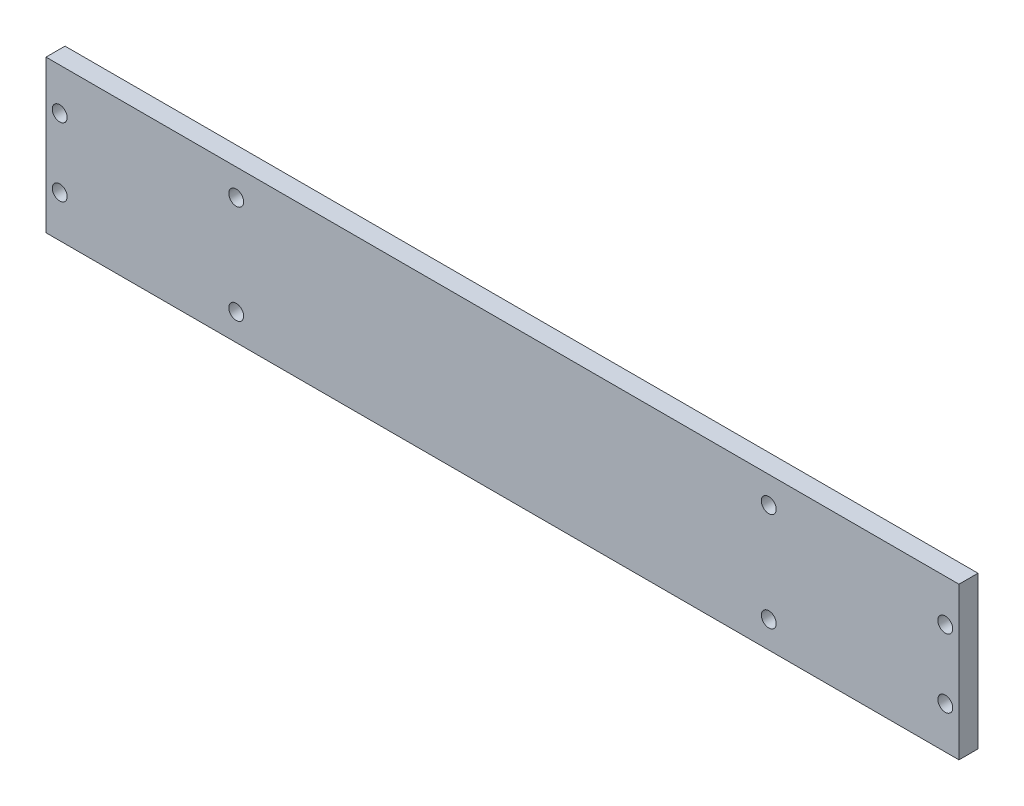
ISO-10303-21;
HEADER;
FILE_DESCRIPTION(('STEP AP214'),'2;1');
FILE_NAME('part.step','',(''),(''),'','','');
FILE_SCHEMA(('AUTOMOTIVE_DESIGN { 1 0 10303 214 1 1 1 1 }'));
ENDSEC;
DATA;
#1=APPLICATION_CONTEXT('core data for automotive mechanical design processes');
#2=APPLICATION_PROTOCOL_DEFINITION('international standard','automotive_design',2000,#1);
#3=PRODUCT_CONTEXT('',#1,'mechanical');
#4=PRODUCT('Part','Part','',(#3));
#5=PRODUCT_RELATED_PRODUCT_CATEGORY('part','',(#4));
#6=PRODUCT_DEFINITION_FORMATION('','',#4);
#7=PRODUCT_DEFINITION_CONTEXT('part definition',#1,'design');
#8=PRODUCT_DEFINITION('design','',#6,#7);
#9=PRODUCT_DEFINITION_SHAPE('','',#8);
#10=(LENGTH_UNIT() NAMED_UNIT(*) SI_UNIT(.MILLI.,.METRE.));
#11=(NAMED_UNIT(*) PLANE_ANGLE_UNIT() SI_UNIT($,.RADIAN.));
#12=(NAMED_UNIT(*) SI_UNIT($,.STERADIAN.) SOLID_ANGLE_UNIT());
#13=UNCERTAINTY_MEASURE_WITH_UNIT(LENGTH_MEASURE(1.E-05),#10,'distance_accuracy_value','');
#14=(GEOMETRIC_REPRESENTATION_CONTEXT(3) GLOBAL_UNCERTAINTY_ASSIGNED_CONTEXT((#13)) GLOBAL_UNIT_ASSIGNED_CONTEXT((#10,
#11,#12)) REPRESENTATION_CONTEXT('',''));
#15=CARTESIAN_POINT('',(0.,0.,0.));
#16=DIRECTION('',(0.,0.,1.));
#17=DIRECTION('',(1.,0.,0.));
#18=AXIS2_PLACEMENT_3D('',#15,#16,#17);
#19=CARTESIAN_POINT('',(0.,0.,6.35));
#20=DIRECTION('',(0.,0.,1.));
#21=DIRECTION('',(1.,0.,0.));
#22=AXIS2_PLACEMENT_3D('',#19,#20,#21);
#23=PLANE('',#22);
#24=CARTESIAN_POINT('',(147.828,11.43,6.35));
#25=DIRECTION('',(0.,0.,1.));
#26=DIRECTION('',(1.,0.,0.));
#27=AXIS2_PLACEMENT_3D('',#24,#25,#26);
#28=CIRCLE('',#27,2.4892);
#29=CARTESIAN_POINT('',(150.3172,11.43,6.35));
#30=VERTEX_POINT('',#29);
#31=EDGE_CURVE('E153',#30,#30,#28,.T.);
#32=ORIENTED_EDGE('',*,*,#31,.F.);
#33=EDGE_LOOP('',(#32));
#34=FACE_BOUND('',#33,.T.);
#35=CARTESIAN_POINT('',(-147.828,11.43,6.35));
#36=DIRECTION('',(0.,0.,1.));
#37=DIRECTION('',(1.,0.,0.));
#38=AXIS2_PLACEMENT_3D('',#35,#36,#37);
#39=CIRCLE('',#38,2.4892);
#40=CARTESIAN_POINT('',(-145.3388,11.43,6.35));
#41=VERTEX_POINT('',#40);
#42=EDGE_CURVE('E141',#41,#41,#39,.T.);
#43=ORIENTED_EDGE('',*,*,#42,.F.);
#44=EDGE_LOOP('',(#43));
#45=FACE_BOUND('',#44,.T.);
#46=CARTESIAN_POINT('',(88.9,-16.51,6.35));
#47=DIRECTION('',(0.,0.,1.));
#48=DIRECTION('',(1.,0.,0.));
#49=AXIS2_PLACEMENT_3D('',#46,#47,#48);
#50=CIRCLE('',#49,2.4892);
#51=CARTESIAN_POINT('',(91.3892,-16.51,6.35));
#52=VERTEX_POINT('',#51);
#53=EDGE_CURVE('E129',#52,#52,#50,.T.);
#54=ORIENTED_EDGE('',*,*,#53,.F.);
#55=EDGE_LOOP('',(#54));
#56=FACE_BOUND('',#55,.T.);
#57=CARTESIAN_POINT('',(-88.9,16.51,6.35));
#58=DIRECTION('',(0.,0.,1.));
#59=DIRECTION('',(1.,0.,0.));
#60=AXIS2_PLACEMENT_3D('',#57,#58,#59);
#61=CIRCLE('',#60,2.4892);
#62=CARTESIAN_POINT('',(-86.4108,16.51,6.35));
#63=VERTEX_POINT('',#62);
#64=EDGE_CURVE('E108',#63,#63,#61,.T.);
#65=ORIENTED_EDGE('',*,*,#64,.F.);
#66=EDGE_LOOP('',(#65));
#67=FACE_BOUND('',#66,.T.);
#68=DIRECTION('',(0.,1.,0.));
#69=VECTOR('',#68,1.);
#70=CARTESIAN_POINT('',(152.4,25.4,6.35));
#71=LINE('',#70,#69);
#72=CARTESIAN_POINT('',(152.4,-25.4,6.35));
#73=VERTEX_POINT('',#72);
#74=CARTESIAN_POINT('',(152.4,25.4,6.35));
#75=VERTEX_POINT('',#74);
#76=EDGE_CURVE('E93',#73,#75,#71,.T.);
#77=ORIENTED_EDGE('',*,*,#76,.T.);
#78=DIRECTION('',(-1.,0.,0.));
#79=VECTOR('',#78,1.);
#80=CARTESIAN_POINT('',(-152.4,25.4,6.35));
#81=LINE('',#80,#79);
#82=CARTESIAN_POINT('',(-152.4,25.4,6.35));
#83=VERTEX_POINT('',#82);
#84=EDGE_CURVE('E88',#75,#83,#81,.T.);
#85=ORIENTED_EDGE('',*,*,#84,.T.);
#86=DIRECTION('',(0.,-1.,0.));
#87=VECTOR('',#86,1.);
#88=CARTESIAN_POINT('',(-152.4,25.4,6.35));
#89=LINE('',#88,#87);
#90=CARTESIAN_POINT('',(-152.4,-25.4,6.35));
#91=VERTEX_POINT('',#90);
#92=EDGE_CURVE('E91',#83,#91,#89,.T.);
#93=ORIENTED_EDGE('',*,*,#92,.T.);
#94=DIRECTION('',(1.,0.,0.));
#95=VECTOR('',#94,1.);
#96=CARTESIAN_POINT('',(-152.4,-25.4,6.35));
#97=LINE('',#96,#95);
#98=EDGE_CURVE('E58',#91,#73,#97,.T.);
#99=ORIENTED_EDGE('',*,*,#98,.T.);
#100=EDGE_LOOP('',(#77,#85,#93,#99));
#101=FACE_BOUND('',#100,.T.);
#102=CARTESIAN_POINT('',(-88.9,-16.51,6.35));
#103=DIRECTION('',(0.,0.,1.));
#104=DIRECTION('',(1.,0.,0.));
#105=AXIS2_PLACEMENT_3D('',#102,#103,#104);
#106=CIRCLE('',#105,2.4892);
#107=CARTESIAN_POINT('',(-86.4108,-16.51,6.35));
#108=VERTEX_POINT('',#107);
#109=EDGE_CURVE('E123',#108,#108,#106,.T.);
#110=ORIENTED_EDGE('',*,*,#109,.F.);
#111=EDGE_LOOP('',(#110));
#112=FACE_BOUND('',#111,.T.);
#113=CARTESIAN_POINT('',(88.9,16.51,6.35));
#114=DIRECTION('',(0.,0.,1.));
#115=DIRECTION('',(1.,0.,0.));
#116=AXIS2_PLACEMENT_3D('',#113,#114,#115);
#117=CIRCLE('',#116,2.4892);
#118=CARTESIAN_POINT('',(91.3892,16.51,6.35));
#119=VERTEX_POINT('',#118);
#120=EDGE_CURVE('E135',#119,#119,#117,.T.);
#121=ORIENTED_EDGE('',*,*,#120,.F.);
#122=EDGE_LOOP('',(#121));
#123=FACE_BOUND('',#122,.T.);
#124=CARTESIAN_POINT('',(-147.828,-11.43,6.35));
#125=DIRECTION('',(0.,0.,1.));
#126=DIRECTION('',(1.,0.,0.));
#127=AXIS2_PLACEMENT_3D('',#124,#125,#126);
#128=CIRCLE('',#127,2.4892);
#129=CARTESIAN_POINT('',(-145.3388,-11.43,6.35));
#130=VERTEX_POINT('',#129);
#131=EDGE_CURVE('E147',#130,#130,#128,.T.);
#132=ORIENTED_EDGE('',*,*,#131,.F.);
#133=EDGE_LOOP('',(#132));
#134=FACE_BOUND('',#133,.T.);
#135=CARTESIAN_POINT('',(147.828,-11.43,6.35));
#136=DIRECTION('',(0.,0.,1.));
#137=DIRECTION('',(1.,0.,0.));
#138=AXIS2_PLACEMENT_3D('',#135,#136,#137);
#139=CIRCLE('',#138,2.4892);
#140=CARTESIAN_POINT('',(150.3172,-11.43,6.35));
#141=VERTEX_POINT('',#140);
#142=EDGE_CURVE('E159',#141,#141,#139,.T.);
#143=ORIENTED_EDGE('',*,*,#142,.F.);
#144=EDGE_LOOP('',(#143));
#145=FACE_BOUND('',#144,.T.);
#146=ADVANCED_FACE('F41',(#34,#45,#56,#67,#101,#112,#123,#134,#145),#23,.T.);
#147=CARTESIAN_POINT('',(0.,0.,0.));
#148=DIRECTION('',(0.,0.,1.));
#149=DIRECTION('',(1.,0.,0.));
#150=AXIS2_PLACEMENT_3D('',#147,#148,#149);
#151=PLANE('',#150);
#152=DIRECTION('',(0.,1.,0.));
#153=VECTOR('',#152,1.);
#154=CARTESIAN_POINT('',(152.4,25.4,0.));
#155=LINE('',#154,#153);
#156=CARTESIAN_POINT('',(152.4,-25.4,0.));
#157=VERTEX_POINT('',#156);
#158=CARTESIAN_POINT('',(152.4,25.4,0.));
#159=VERTEX_POINT('',#158);
#160=EDGE_CURVE('E105',#157,#159,#155,.T.);
#161=ORIENTED_EDGE('',*,*,#160,.F.);
#162=DIRECTION('',(1.,0.,0.));
#163=VECTOR('',#162,1.);
#164=CARTESIAN_POINT('',(-152.4,-25.4,0.));
#165=LINE('',#164,#163);
#166=CARTESIAN_POINT('',(-152.4,-25.4,0.));
#167=VERTEX_POINT('',#166);
#168=EDGE_CURVE('E81',#167,#157,#165,.T.);
#169=ORIENTED_EDGE('',*,*,#168,.F.);
#170=DIRECTION('',(0.,-1.,0.));
#171=VECTOR('',#170,1.);
#172=CARTESIAN_POINT('',(-152.4,25.4,0.));
#173=LINE('',#172,#171);
#174=CARTESIAN_POINT('',(-152.4,25.4,0.));
#175=VERTEX_POINT('',#174);
#176=EDGE_CURVE('E75',#175,#167,#173,.T.);
#177=ORIENTED_EDGE('',*,*,#176,.F.);
#178=DIRECTION('',(-1.,0.,0.));
#179=VECTOR('',#178,1.);
#180=CARTESIAN_POINT('',(-152.4,25.4,0.));
#181=LINE('',#180,#179);
#182=EDGE_CURVE('E97',#159,#175,#181,.T.);
#183=ORIENTED_EDGE('',*,*,#182,.F.);
#184=EDGE_LOOP('',(#161,#169,#177,#183));
#185=FACE_BOUND('',#184,.T.);
#186=CARTESIAN_POINT('',(-88.9,16.51,0.));
#187=DIRECTION('',(0.,0.,1.));
#188=DIRECTION('',(1.,0.,0.));
#189=AXIS2_PLACEMENT_3D('',#186,#187,#188);
#190=CIRCLE('',#189,2.4892);
#191=CARTESIAN_POINT('',(-86.4108,16.51,0.));
#192=VERTEX_POINT('',#191);
#193=EDGE_CURVE('E120',#192,#192,#190,.T.);
#194=ORIENTED_EDGE('',*,*,#193,.T.);
#195=EDGE_LOOP('',(#194));
#196=FACE_BOUND('',#195,.T.);
#197=CARTESIAN_POINT('',(-88.9,-16.51,0.));
#198=DIRECTION('',(0.,0.,1.));
#199=DIRECTION('',(1.,0.,0.));
#200=AXIS2_PLACEMENT_3D('',#197,#198,#199);
#201=CIRCLE('',#200,2.4892);
#202=CARTESIAN_POINT('',(-86.4108,-16.51,0.));
#203=VERTEX_POINT('',#202);
#204=EDGE_CURVE('E126',#203,#203,#201,.T.);
#205=ORIENTED_EDGE('',*,*,#204,.T.);
#206=EDGE_LOOP('',(#205));
#207=FACE_BOUND('',#206,.T.);
#208=CARTESIAN_POINT('',(88.9,-16.51,0.));
#209=DIRECTION('',(0.,0.,1.));
#210=DIRECTION('',(1.,0.,0.));
#211=AXIS2_PLACEMENT_3D('',#208,#209,#210);
#212=CIRCLE('',#211,2.4892);
#213=CARTESIAN_POINT('',(91.3892,-16.51,0.));
#214=VERTEX_POINT('',#213);
#215=EDGE_CURVE('E132',#214,#214,#212,.T.);
#216=ORIENTED_EDGE('',*,*,#215,.T.);
#217=EDGE_LOOP('',(#216));
#218=FACE_BOUND('',#217,.T.);
#219=CARTESIAN_POINT('',(88.9,16.51,0.));
#220=DIRECTION('',(0.,0.,1.));
#221=DIRECTION('',(1.,0.,0.));
#222=AXIS2_PLACEMENT_3D('',#219,#220,#221);
#223=CIRCLE('',#222,2.4892);
#224=CARTESIAN_POINT('',(91.3892,16.51,0.));
#225=VERTEX_POINT('',#224);
#226=EDGE_CURVE('E138',#225,#225,#223,.T.);
#227=ORIENTED_EDGE('',*,*,#226,.T.);
#228=EDGE_LOOP('',(#227));
#229=FACE_BOUND('',#228,.T.);
#230=CARTESIAN_POINT('',(-147.828,11.43,0.));
#231=DIRECTION('',(0.,0.,1.));
#232=DIRECTION('',(1.,0.,0.));
#233=AXIS2_PLACEMENT_3D('',#230,#231,#232);
#234=CIRCLE('',#233,2.4892);
#235=CARTESIAN_POINT('',(-145.3388,11.43,0.));
#236=VERTEX_POINT('',#235);
#237=EDGE_CURVE('E144',#236,#236,#234,.T.);
#238=ORIENTED_EDGE('',*,*,#237,.T.);
#239=EDGE_LOOP('',(#238));
#240=FACE_BOUND('',#239,.T.);
#241=CARTESIAN_POINT('',(-147.828,-11.43,0.));
#242=DIRECTION('',(0.,0.,1.));
#243=DIRECTION('',(1.,0.,0.));
#244=AXIS2_PLACEMENT_3D('',#241,#242,#243);
#245=CIRCLE('',#244,2.4892);
#246=CARTESIAN_POINT('',(-145.3388,-11.43,0.));
#247=VERTEX_POINT('',#246);
#248=EDGE_CURVE('E150',#247,#247,#245,.T.);
#249=ORIENTED_EDGE('',*,*,#248,.T.);
#250=EDGE_LOOP('',(#249));
#251=FACE_BOUND('',#250,.T.);
#252=CARTESIAN_POINT('',(147.828,11.43,0.));
#253=DIRECTION('',(0.,0.,1.));
#254=DIRECTION('',(1.,0.,0.));
#255=AXIS2_PLACEMENT_3D('',#252,#253,#254);
#256=CIRCLE('',#255,2.4892);
#257=CARTESIAN_POINT('',(150.3172,11.43,0.));
#258=VERTEX_POINT('',#257);
#259=EDGE_CURVE('E156',#258,#258,#256,.T.);
#260=ORIENTED_EDGE('',*,*,#259,.T.);
#261=EDGE_LOOP('',(#260));
#262=FACE_BOUND('',#261,.T.);
#263=CARTESIAN_POINT('',(147.828,-11.43,0.));
#264=DIRECTION('',(0.,0.,1.));
#265=DIRECTION('',(1.,0.,0.));
#266=AXIS2_PLACEMENT_3D('',#263,#264,#265);
#267=CIRCLE('',#266,2.4892);
#268=CARTESIAN_POINT('',(150.3172,-11.43,0.));
#269=VERTEX_POINT('',#268);
#270=EDGE_CURVE('E162',#269,#269,#267,.T.);
#271=ORIENTED_EDGE('',*,*,#270,.T.);
#272=EDGE_LOOP('',(#271));
#273=FACE_BOUND('',#272,.T.);
#274=ADVANCED_FACE('F116',(#185,#196,#207,#218,#229,#240,#251,#262,#273),#151,.F.);
#275=CARTESIAN_POINT('',(152.4,25.4,6.35));
#276=DIRECTION('',(-1.,0.,0.));
#277=DIRECTION('',(0.,0.,1.));
#278=AXIS2_PLACEMENT_3D('',#275,#276,#277);
#279=PLANE('',#278);
#280=ORIENTED_EDGE('',*,*,#160,.T.);
#281=DIRECTION('',(0.,0.,-1.));
#282=VECTOR('',#281,1.);
#283=CARTESIAN_POINT('',(152.4,25.4,6.35));
#284=LINE('',#283,#282);
#285=EDGE_CURVE('E11',#75,#159,#284,.T.);
#286=ORIENTED_EDGE('',*,*,#285,.F.);
#287=ORIENTED_EDGE('',*,*,#76,.F.);
#288=DIRECTION('',(0.,0.,-1.));
#289=VECTOR('',#288,1.);
#290=CARTESIAN_POINT('',(152.4,-25.4,6.35));
#291=LINE('',#290,#289);
#292=EDGE_CURVE('E101',#73,#157,#291,.T.);
#293=ORIENTED_EDGE('',*,*,#292,.T.);
#294=EDGE_LOOP('',(#280,#286,#287,#293));
#295=FACE_BOUND('',#294,.T.);
#296=ADVANCED_FACE('F43',(#295),#279,.F.);
#297=CARTESIAN_POINT('',(-152.4,25.4,6.35));
#298=DIRECTION('',(0.,-1.,0.));
#299=DIRECTION('',(0.,0.,-1.));
#300=AXIS2_PLACEMENT_3D('',#297,#298,#299);
#301=PLANE('',#300);
#302=ORIENTED_EDGE('',*,*,#182,.T.);
#303=DIRECTION('',(0.,0.,-1.));
#304=VECTOR('',#303,1.);
#305=CARTESIAN_POINT('',(-152.4,25.4,6.35));
#306=LINE('',#305,#304);
#307=EDGE_CURVE('E50',#83,#175,#306,.T.);
#308=ORIENTED_EDGE('',*,*,#307,.F.);
#309=ORIENTED_EDGE('',*,*,#84,.F.);
#310=ORIENTED_EDGE('',*,*,#285,.T.);
#311=EDGE_LOOP('',(#302,#308,#309,#310));
#312=FACE_BOUND('',#311,.T.);
#313=ADVANCED_FACE('F96',(#312),#301,.F.);
#314=CARTESIAN_POINT('',(-152.4,25.4,6.35));
#315=DIRECTION('',(1.,0.,0.));
#316=DIRECTION('',(0.,0.,-1.));
#317=AXIS2_PLACEMENT_3D('',#314,#315,#316);
#318=PLANE('',#317);
#319=ORIENTED_EDGE('',*,*,#176,.T.);
#320=DIRECTION('',(0.,0.,-1.));
#321=VECTOR('',#320,1.);
#322=CARTESIAN_POINT('',(-152.4,-25.4,6.35));
#323=LINE('',#322,#321);
#324=EDGE_CURVE('E98',#91,#167,#323,.T.);
#325=ORIENTED_EDGE('',*,*,#324,.F.);
#326=ORIENTED_EDGE('',*,*,#92,.F.);
#327=ORIENTED_EDGE('',*,*,#307,.T.);
#328=EDGE_LOOP('',(#319,#325,#326,#327));
#329=FACE_BOUND('',#328,.T.);
#330=ADVANCED_FACE('F99',(#329),#318,.F.);
#331=CARTESIAN_POINT('',(-152.4,-25.4,6.35));
#332=DIRECTION('',(0.,1.,0.));
#333=DIRECTION('',(0.,0.,1.));
#334=AXIS2_PLACEMENT_3D('',#331,#332,#333);
#335=PLANE('',#334);
#336=ORIENTED_EDGE('',*,*,#168,.T.);
#337=ORIENTED_EDGE('',*,*,#292,.F.);
#338=ORIENTED_EDGE('',*,*,#98,.F.);
#339=ORIENTED_EDGE('',*,*,#324,.T.);
#340=EDGE_LOOP('',(#336,#337,#338,#339));
#341=FACE_BOUND('',#340,.T.);
#342=ADVANCED_FACE('F113',(#341),#335,.F.);
#343=CARTESIAN_POINT('',(-88.9,16.51,6.35));
#344=DIRECTION('',(0.,0.,-1.));
#345=DIRECTION('',(-1.,0.,0.));
#346=AXIS2_PLACEMENT_3D('',#343,#344,#345);
#347=CYLINDRICAL_SURFACE('',#346,2.4892);
#348=ORIENTED_EDGE('',*,*,#64,.T.);
#349=EDGE_LOOP('',(#348));
#350=FACE_BOUND('',#349,.T.);
#351=ORIENTED_EDGE('',*,*,#193,.F.);
#352=EDGE_LOOP('',(#351));
#353=FACE_BOUND('',#352,.T.);
#354=ADVANCED_FACE('F181',(#350,#353),#347,.F.);
#355=CARTESIAN_POINT('',(-88.9,-16.51,6.35));
#356=DIRECTION('',(0.,0.,-1.));
#357=DIRECTION('',(-1.,0.,0.));
#358=AXIS2_PLACEMENT_3D('',#355,#356,#357);
#359=CYLINDRICAL_SURFACE('',#358,2.4892);
#360=ORIENTED_EDGE('',*,*,#109,.T.);
#361=EDGE_LOOP('',(#360));
#362=FACE_BOUND('',#361,.T.);
#363=ORIENTED_EDGE('',*,*,#204,.F.);
#364=EDGE_LOOP('',(#363));
#365=FACE_BOUND('',#364,.T.);
#366=ADVANCED_FACE('F235',(#362,#365),#359,.F.);
#367=CARTESIAN_POINT('',(88.9,-16.51,6.35));
#368=DIRECTION('',(0.,0.,-1.));
#369=DIRECTION('',(-1.,0.,0.));
#370=AXIS2_PLACEMENT_3D('',#367,#368,#369);
#371=CYLINDRICAL_SURFACE('',#370,2.4892);
#372=ORIENTED_EDGE('',*,*,#53,.T.);
#373=EDGE_LOOP('',(#372));
#374=FACE_BOUND('',#373,.T.);
#375=ORIENTED_EDGE('',*,*,#215,.F.);
#376=EDGE_LOOP('',(#375));
#377=FACE_BOUND('',#376,.T.);
#378=ADVANCED_FACE('F244',(#374,#377),#371,.F.);
#379=CARTESIAN_POINT('',(88.9,16.51,6.35));
#380=DIRECTION('',(0.,0.,-1.));
#381=DIRECTION('',(-1.,0.,0.));
#382=AXIS2_PLACEMENT_3D('',#379,#380,#381);
#383=CYLINDRICAL_SURFACE('',#382,2.4892);
#384=ORIENTED_EDGE('',*,*,#120,.T.);
#385=EDGE_LOOP('',(#384));
#386=FACE_BOUND('',#385,.T.);
#387=ORIENTED_EDGE('',*,*,#226,.F.);
#388=EDGE_LOOP('',(#387));
#389=FACE_BOUND('',#388,.T.);
#390=ADVANCED_FACE('F253',(#386,#389),#383,.F.);
#391=CARTESIAN_POINT('',(-147.828,11.43,6.35));
#392=DIRECTION('',(0.,0.,-1.));
#393=DIRECTION('',(-1.,0.,0.));
#394=AXIS2_PLACEMENT_3D('',#391,#392,#393);
#395=CYLINDRICAL_SURFACE('',#394,2.4892);
#396=ORIENTED_EDGE('',*,*,#42,.T.);
#397=EDGE_LOOP('',(#396));
#398=FACE_BOUND('',#397,.T.);
#399=ORIENTED_EDGE('',*,*,#237,.F.);
#400=EDGE_LOOP('',(#399));
#401=FACE_BOUND('',#400,.T.);
#402=ADVANCED_FACE('F263',(#398,#401),#395,.F.);
#403=CARTESIAN_POINT('',(-147.828,-11.43,6.35));
#404=DIRECTION('',(0.,0.,-1.));
#405=DIRECTION('',(-1.,0.,0.));
#406=AXIS2_PLACEMENT_3D('',#403,#404,#405);
#407=CYLINDRICAL_SURFACE('',#406,2.4892);
#408=ORIENTED_EDGE('',*,*,#131,.T.);
#409=EDGE_LOOP('',(#408));
#410=FACE_BOUND('',#409,.T.);
#411=ORIENTED_EDGE('',*,*,#248,.F.);
#412=EDGE_LOOP('',(#411));
#413=FACE_BOUND('',#412,.T.);
#414=ADVANCED_FACE('F273',(#410,#413),#407,.F.);
#415=CARTESIAN_POINT('',(147.828,11.43,6.35));
#416=DIRECTION('',(0.,0.,-1.));
#417=DIRECTION('',(-1.,0.,0.));
#418=AXIS2_PLACEMENT_3D('',#415,#416,#417);
#419=CYLINDRICAL_SURFACE('',#418,2.4892);
#420=ORIENTED_EDGE('',*,*,#31,.T.);
#421=EDGE_LOOP('',(#420));
#422=FACE_BOUND('',#421,.T.);
#423=ORIENTED_EDGE('',*,*,#259,.F.);
#424=EDGE_LOOP('',(#423));
#425=FACE_BOUND('',#424,.T.);
#426=ADVANCED_FACE('F283',(#422,#425),#419,.F.);
#427=CARTESIAN_POINT('',(147.828,-11.43,6.35));
#428=DIRECTION('',(0.,0.,-1.));
#429=DIRECTION('',(-1.,0.,0.));
#430=AXIS2_PLACEMENT_3D('',#427,#428,#429);
#431=CYLINDRICAL_SURFACE('',#430,2.4892);
#432=ORIENTED_EDGE('',*,*,#142,.T.);
#433=EDGE_LOOP('',(#432));
#434=FACE_BOUND('',#433,.T.);
#435=ORIENTED_EDGE('',*,*,#270,.F.);
#436=EDGE_LOOP('',(#435));
#437=FACE_BOUND('',#436,.T.);
#438=ADVANCED_FACE('F168',(#434,#437),#431,.F.);
#439=CLOSED_SHELL('',(#146,#274,#296,#313,#330,#342,#354,#366,#378,#390,#402,#414,#426,#438));
#440=MANIFOLD_SOLID_BREP('B2',#439);
#441=ADVANCED_BREP_SHAPE_REPRESENTATION('',(#18,#440),#14);
#442=SHAPE_DEFINITION_REPRESENTATION(#9,#441);
ENDSEC;
END-ISO-10303-21;
